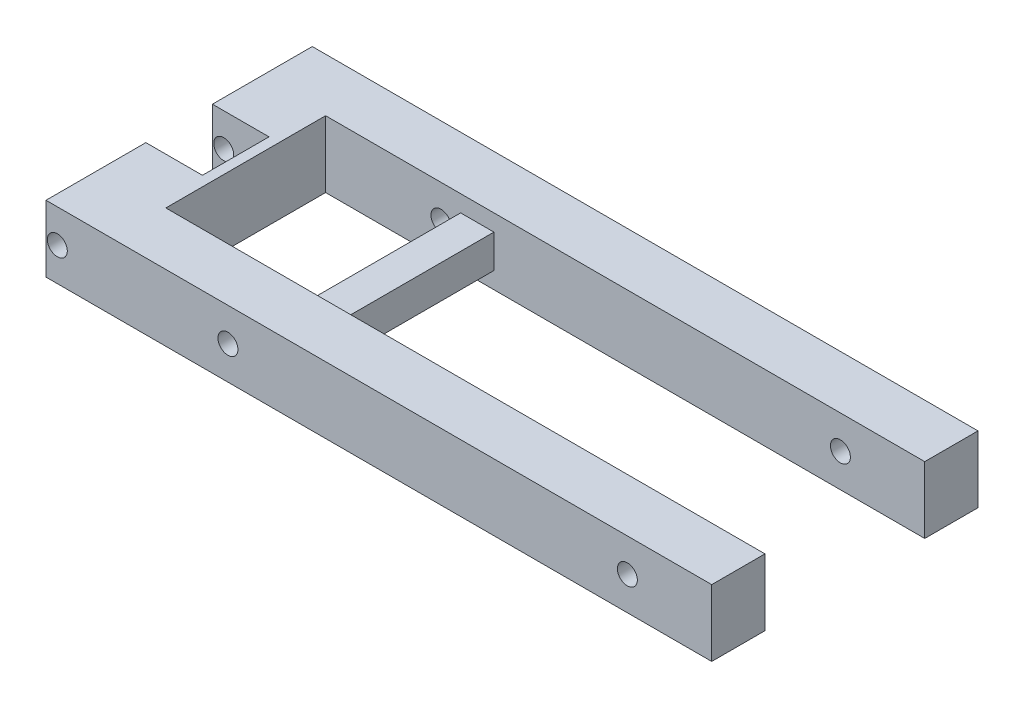
ISO-10303-21;
HEADER;
FILE_DESCRIPTION(('STEP AP214'),'2;1');
FILE_NAME('part.step','',(''),(''),'','','');
FILE_SCHEMA(('AUTOMOTIVE_DESIGN { 1 0 10303 214 1 1 1 1 }'));
ENDSEC;
DATA;
#1=APPLICATION_CONTEXT('core data for automotive mechanical design processes');
#2=APPLICATION_PROTOCOL_DEFINITION('international standard','automotive_design',2000,#1);
#3=PRODUCT_CONTEXT('',#1,'mechanical');
#4=PRODUCT('Part','Part','',(#3));
#5=PRODUCT_RELATED_PRODUCT_CATEGORY('part','',(#4));
#6=PRODUCT_DEFINITION_FORMATION('','',#4);
#7=PRODUCT_DEFINITION_CONTEXT('part definition',#1,'design');
#8=PRODUCT_DEFINITION('design','',#6,#7);
#9=PRODUCT_DEFINITION_SHAPE('','',#8);
#10=(LENGTH_UNIT() NAMED_UNIT(*) SI_UNIT(.MILLI.,.METRE.));
#11=(NAMED_UNIT(*) PLANE_ANGLE_UNIT() SI_UNIT($,.RADIAN.));
#12=(NAMED_UNIT(*) SI_UNIT($,.STERADIAN.) SOLID_ANGLE_UNIT());
#13=UNCERTAINTY_MEASURE_WITH_UNIT(LENGTH_MEASURE(1.E-05),#10,'distance_accuracy_value','');
#14=(GEOMETRIC_REPRESENTATION_CONTEXT(3) GLOBAL_UNCERTAINTY_ASSIGNED_CONTEXT((#13)) GLOBAL_UNIT_ASSIGNED_CONTEXT((#10,
#11,#12)) REPRESENTATION_CONTEXT('',''));
#15=CARTESIAN_POINT('',(0.,0.,0.));
#16=DIRECTION('',(0.,0.,1.));
#17=DIRECTION('',(1.,0.,0.));
#18=AXIS2_PLACEMENT_3D('',#15,#16,#17);
#19=CARTESIAN_POINT('',(-332.846822005894,100.,200.));
#20=DIRECTION('',(1.,0.,0.));
#21=DIRECTION('',(0.,0.,-1.));
#22=AXIS2_PLACEMENT_3D('',#19,#20,#21);
#23=PLANE('',#22);
#24=DIRECTION('',(0.,-1.,0.));
#25=VECTOR('',#24,1.);
#26=CARTESIAN_POINT('',(-332.846822005894,100.,50.));
#27=LINE('',#26,#25);
#28=CARTESIAN_POINT('',(-332.846822005894,100.,50.));
#29=VERTEX_POINT('',#28);
#30=CARTESIAN_POINT('',(-332.846822005894,0.,50.));
#31=VERTEX_POINT('',#30);
#32=EDGE_CURVE('E227',#29,#31,#27,.T.);
#33=ORIENTED_EDGE('',*,*,#32,.T.);
#34=DIRECTION('',(0.,0.,1.));
#35=VECTOR('',#34,1.);
#36=CARTESIAN_POINT('',(-332.846822005894,0.,200.));
#37=LINE('',#36,#35);
#38=CARTESIAN_POINT('',(-332.846822005894,0.,200.));
#39=VERTEX_POINT('',#38);
#40=EDGE_CURVE('E322',#31,#39,#37,.T.);
#41=ORIENTED_EDGE('',*,*,#40,.T.);
#42=DIRECTION('',(0.,-1.,0.));
#43=VECTOR('',#42,1.);
#44=CARTESIAN_POINT('',(-332.846822005894,100.,200.));
#45=LINE('',#44,#43);
#46=CARTESIAN_POINT('',(-332.846822005894,100.,200.));
#47=VERTEX_POINT('',#46);
#48=EDGE_CURVE('E339',#47,#39,#45,.T.);
#49=ORIENTED_EDGE('',*,*,#48,.F.);
#50=DIRECTION('',(0.,0.,1.));
#51=VECTOR('',#50,1.);
#52=CARTESIAN_POINT('',(-332.846822005894,100.,200.));
#53=LINE('',#52,#51);
#54=EDGE_CURVE('E295',#29,#47,#53,.T.);
#55=ORIENTED_EDGE('',*,*,#54,.F.);
#56=EDGE_LOOP('',(#33,#41,#49,#55));
#57=FACE_BOUND('',#56,.T.);
#58=ADVANCED_FACE('F39',(#57),#23,.F.);
#59=CARTESIAN_POINT('',(-315.846822005894,50.,-200.));
#60=DIRECTION('',(0.,0.,1.));
#61=DIRECTION('',(1.,0.,0.));
#62=AXIS2_PLACEMENT_3D('',#59,#60,#61);
#63=CYLINDRICAL_SURFACE('',#62,15.);
#64=CARTESIAN_POINT('',(-315.846822005894,50.,200.));
#65=DIRECTION('',(0.,0.,1.));
#66=DIRECTION('',(1.,0.,0.));
#67=AXIS2_PLACEMENT_3D('',#64,#65,#66);
#68=CIRCLE('',#67,15.);
#69=CARTESIAN_POINT('',(-300.846822005894,50.,200.));
#70=VERTEX_POINT('',#69);
#71=EDGE_CURVE('E237',#70,#70,#68,.T.);
#72=ORIENTED_EDGE('',*,*,#71,.T.);
#73=EDGE_LOOP('',(#72));
#74=FACE_BOUND('',#73,.T.);
#75=CARTESIAN_POINT('',(-315.846822005894,50.,50.));
#76=DIRECTION('',(0.,0.,-1.));
#77=DIRECTION('',(-1.,0.,0.));
#78=AXIS2_PLACEMENT_3D('',#75,#76,#77);
#79=CIRCLE('',#78,15.);
#80=CARTESIAN_POINT('',(-330.846822005894,50.,50.));
#81=VERTEX_POINT('',#80);
#82=EDGE_CURVE('E226',#81,#81,#79,.F.);
#83=ORIENTED_EDGE('',*,*,#82,.F.);
#84=EDGE_LOOP('',(#83));
#85=FACE_BOUND('',#84,.T.);
#86=ADVANCED_FACE('F388',(#74,#85),#63,.F.);
#87=CARTESIAN_POINT('',(667.153177994106,100.,120.));
#88=DIRECTION('',(0.,0.,1.));
#89=DIRECTION('',(1.,0.,0.));
#90=AXIS2_PLACEMENT_3D('',#87,#88,#89);
#91=PLANE('',#90);
#92=DIRECTION('',(-1.,0.,0.));
#93=VECTOR('',#92,1.);
#94=CARTESIAN_POINT('',(-30.,75.,120.));
#95=LINE('',#94,#93);
#96=CARTESIAN_POINT('',(20.,75.,120.));
#97=VERTEX_POINT('',#96);
#98=CARTESIAN_POINT('',(-30.,75.,120.));
#99=VERTEX_POINT('',#98);
#100=EDGE_CURVE('E168',#97,#99,#95,.T.);
#101=ORIENTED_EDGE('',*,*,#100,.T.);
#102=DIRECTION('',(0.,-1.,0.));
#103=VECTOR('',#102,1.);
#104=CARTESIAN_POINT('',(-30.,25.,120.));
#105=LINE('',#104,#103);
#106=CARTESIAN_POINT('',(-30.,25.,120.));
#107=VERTEX_POINT('',#106);
#108=EDGE_CURVE('E57',#99,#107,#105,.T.);
#109=ORIENTED_EDGE('',*,*,#108,.T.);
#110=DIRECTION('',(1.,0.,0.));
#111=VECTOR('',#110,1.);
#112=CARTESIAN_POINT('',(20.,25.,120.));
#113=LINE('',#112,#111);
#114=CARTESIAN_POINT('',(20.,25.,120.));
#115=VERTEX_POINT('',#114);
#116=EDGE_CURVE('E175',#107,#115,#113,.T.);
#117=ORIENTED_EDGE('',*,*,#116,.T.);
#118=DIRECTION('',(0.,1.,0.));
#119=VECTOR('',#118,1.);
#120=CARTESIAN_POINT('',(20.,75.,120.));
#121=LINE('',#120,#119);
#122=EDGE_CURVE('E158',#115,#97,#121,.T.);
#123=ORIENTED_EDGE('',*,*,#122,.T.);
#124=EDGE_LOOP('',(#101,#109,#117,#123));
#125=FACE_BOUND('',#124,.T.);
#126=CARTESIAN_POINT('',(-59.546822005894,50.,120.));
#127=DIRECTION('',(0.,0.,1.));
#128=DIRECTION('',(1.,0.,0.));
#129=AXIS2_PLACEMENT_3D('',#126,#127,#128);
#130=CIRCLE('',#129,15.0000000000001);
#131=CARTESIAN_POINT('',(-44.5468220058939,50.,120.));
#132=VERTEX_POINT('',#131);
#133=EDGE_CURVE('E273',#132,#132,#130,.T.);
#134=ORIENTED_EDGE('',*,*,#133,.T.);
#135=EDGE_LOOP('',(#134));
#136=FACE_BOUND('',#135,.T.);
#137=CARTESIAN_POINT('',(540.453177994106,50.,120.));
#138=DIRECTION('',(0.,0.,1.));
#139=DIRECTION('',(1.,0.,0.));
#140=AXIS2_PLACEMENT_3D('',#137,#138,#139);
#141=CIRCLE('',#140,15.);
#142=CARTESIAN_POINT('',(555.453177994106,50.,120.));
#143=VERTEX_POINT('',#142);
#144=EDGE_CURVE('E265',#143,#143,#141,.T.);
#145=ORIENTED_EDGE('',*,*,#144,.T.);
#146=EDGE_LOOP('',(#145));
#147=FACE_BOUND('',#146,.T.);
#148=DIRECTION('',(-1.,0.,0.));
#149=VECTOR('',#148,1.);
#150=CARTESIAN_POINT('',(667.153177994106,0.,120.));
#151=LINE('',#150,#149);
#152=CARTESIAN_POINT('',(667.153177994106,0.,120.));
#153=VERTEX_POINT('',#152);
#154=CARTESIAN_POINT('',(-232.846822005894,0.,120.));
#155=VERTEX_POINT('',#154);
#156=EDGE_CURVE('E277',#153,#155,#151,.T.);
#157=ORIENTED_EDGE('',*,*,#156,.T.);
#158=DIRECTION('',(0.,-1.,0.));
#159=VECTOR('',#158,1.);
#160=CARTESIAN_POINT('',(-232.846822005894,100.,120.));
#161=LINE('',#160,#159);
#162=CARTESIAN_POINT('',(-232.846822005894,100.,120.));
#163=VERTEX_POINT('',#162);
#164=EDGE_CURVE('E11',#163,#155,#161,.T.);
#165=ORIENTED_EDGE('',*,*,#164,.F.);
#166=DIRECTION('',(-1.,0.,0.));
#167=VECTOR('',#166,1.);
#168=CARTESIAN_POINT('',(667.153177994106,100.,120.));
#169=LINE('',#168,#167);
#170=CARTESIAN_POINT('',(667.153177994106,100.,120.));
#171=VERTEX_POINT('',#170);
#172=EDGE_CURVE('E278',#171,#163,#169,.T.);
#173=ORIENTED_EDGE('',*,*,#172,.F.);
#174=DIRECTION('',(0.,-1.,0.));
#175=VECTOR('',#174,1.);
#176=CARTESIAN_POINT('',(667.153177994106,100.,120.));
#177=LINE('',#176,#175);
#178=EDGE_CURVE('E306',#171,#153,#177,.T.);
#179=ORIENTED_EDGE('',*,*,#178,.T.);
#180=EDGE_LOOP('',(#157,#165,#173,#179));
#181=FACE_BOUND('',#180,.T.);
#182=ADVANCED_FACE('F41',(#125,#136,#147,#181),#91,.F.);
#183=CARTESIAN_POINT('',(-232.846822005894,100.,-120.));
#184=DIRECTION('',(-1.,0.,0.));
#185=DIRECTION('',(0.,0.,1.));
#186=AXIS2_PLACEMENT_3D('',#183,#184,#185);
#187=PLANE('',#186);
#188=DIRECTION('',(0.,0.,-1.));
#189=VECTOR('',#188,1.);
#190=CARTESIAN_POINT('',(-232.846822005894,0.,-120.));
#191=LINE('',#190,#189);
#192=CARTESIAN_POINT('',(-232.846822005894,0.,-120.));
#193=VERTEX_POINT('',#192);
#194=EDGE_CURVE('E310',#155,#193,#191,.T.);
#195=ORIENTED_EDGE('',*,*,#194,.T.);
#196=DIRECTION('',(0.,-1.,0.));
#197=VECTOR('',#196,1.);
#198=CARTESIAN_POINT('',(-232.846822005894,100.,-120.));
#199=LINE('',#198,#197);
#200=CARTESIAN_POINT('',(-232.846822005894,100.,-120.));
#201=VERTEX_POINT('',#200);
#202=EDGE_CURVE('E49',#201,#193,#199,.T.);
#203=ORIENTED_EDGE('',*,*,#202,.F.);
#204=DIRECTION('',(0.,0.,-1.));
#205=VECTOR('',#204,1.);
#206=CARTESIAN_POINT('',(-232.846822005894,100.,-120.));
#207=LINE('',#206,#205);
#208=EDGE_CURVE('E282',#163,#201,#207,.T.);
#209=ORIENTED_EDGE('',*,*,#208,.F.);
#210=ORIENTED_EDGE('',*,*,#164,.T.);
#211=EDGE_LOOP('',(#195,#203,#209,#210));
#212=FACE_BOUND('',#211,.T.);
#213=ADVANCED_FACE('F439',(#212),#187,.F.);
#214=CARTESIAN_POINT('',(667.153177994106,100.,-120.));
#215=DIRECTION('',(0.,0.,-1.));
#216=DIRECTION('',(-1.,0.,0.));
#217=AXIS2_PLACEMENT_3D('',#214,#215,#216);
#218=PLANE('',#217);
#219=DIRECTION('',(1.,0.,0.));
#220=VECTOR('',#219,1.);
#221=CARTESIAN_POINT('',(20.,25.,-120.));
#222=LINE('',#221,#220);
#223=CARTESIAN_POINT('',(-30.,25.,-120.));
#224=VERTEX_POINT('',#223);
#225=CARTESIAN_POINT('',(20.,25.,-120.));
#226=VERTEX_POINT('',#225);
#227=EDGE_CURVE('E185',#224,#226,#222,.T.);
#228=ORIENTED_EDGE('',*,*,#227,.F.);
#229=DIRECTION('',(0.,-1.,0.));
#230=VECTOR('',#229,1.);
#231=CARTESIAN_POINT('',(-30.,25.,-120.));
#232=LINE('',#231,#230);
#233=CARTESIAN_POINT('',(-30.,75.,-120.));
#234=VERTEX_POINT('',#233);
#235=EDGE_CURVE('E182',#234,#224,#232,.T.);
#236=ORIENTED_EDGE('',*,*,#235,.F.);
#237=DIRECTION('',(-1.,0.,0.));
#238=VECTOR('',#237,1.);
#239=CARTESIAN_POINT('',(-30.,75.,-120.));
#240=LINE('',#239,#238);
#241=CARTESIAN_POINT('',(20.,75.,-120.));
#242=VERTEX_POINT('',#241);
#243=EDGE_CURVE('E190',#242,#234,#240,.T.);
#244=ORIENTED_EDGE('',*,*,#243,.F.);
#245=DIRECTION('',(0.,1.,0.));
#246=VECTOR('',#245,1.);
#247=CARTESIAN_POINT('',(20.,75.,-120.));
#248=LINE('',#247,#246);
#249=EDGE_CURVE('E161',#226,#242,#248,.T.);
#250=ORIENTED_EDGE('',*,*,#249,.F.);
#251=EDGE_LOOP('',(#228,#236,#244,#250));
#252=FACE_BOUND('',#251,.T.);
#253=CARTESIAN_POINT('',(-59.546822005894,50.,-120.));
#254=DIRECTION('',(0.,0.,-1.));
#255=DIRECTION('',(-1.,0.,0.));
#256=AXIS2_PLACEMENT_3D('',#253,#254,#255);
#257=CIRCLE('',#256,15.0000000000001);
#258=CARTESIAN_POINT('',(-74.546822005894,50.,-120.));
#259=VERTEX_POINT('',#258);
#260=EDGE_CURVE('E269',#259,#259,#257,.T.);
#261=ORIENTED_EDGE('',*,*,#260,.T.);
#262=EDGE_LOOP('',(#261));
#263=FACE_BOUND('',#262,.T.);
#264=CARTESIAN_POINT('',(540.453177994106,50.,-120.));
#265=DIRECTION('',(0.,0.,-1.));
#266=DIRECTION('',(-1.,0.,0.));
#267=AXIS2_PLACEMENT_3D('',#264,#265,#266);
#268=CIRCLE('',#267,15.);
#269=CARTESIAN_POINT('',(525.453177994106,50.,-120.));
#270=VERTEX_POINT('',#269);
#271=EDGE_CURVE('E246',#270,#270,#268,.T.);
#272=ORIENTED_EDGE('',*,*,#271,.T.);
#273=EDGE_LOOP('',(#272));
#274=FACE_BOUND('',#273,.T.);
#275=DIRECTION('',(1.,0.,0.));
#276=VECTOR('',#275,1.);
#277=CARTESIAN_POINT('',(667.153177994106,0.,-120.));
#278=LINE('',#277,#276);
#279=CARTESIAN_POINT('',(667.153177994106,0.,-120.));
#280=VERTEX_POINT('',#279);
#281=EDGE_CURVE('E313',#193,#280,#278,.T.);
#282=ORIENTED_EDGE('',*,*,#281,.T.);
#283=DIRECTION('',(0.,-1.,0.));
#284=VECTOR('',#283,1.);
#285=CARTESIAN_POINT('',(667.153177994106,100.,-120.));
#286=LINE('',#285,#284);
#287=CARTESIAN_POINT('',(667.153177994106,100.,-120.));
#288=VERTEX_POINT('',#287);
#289=EDGE_CURVE('E351',#288,#280,#286,.T.);
#290=ORIENTED_EDGE('',*,*,#289,.F.);
#291=DIRECTION('',(1.,0.,0.));
#292=VECTOR('',#291,1.);
#293=CARTESIAN_POINT('',(667.153177994106,100.,-120.));
#294=LINE('',#293,#292);
#295=EDGE_CURVE('E286',#201,#288,#294,.T.);
#296=ORIENTED_EDGE('',*,*,#295,.F.);
#297=ORIENTED_EDGE('',*,*,#202,.T.);
#298=EDGE_LOOP('',(#282,#290,#296,#297));
#299=FACE_BOUND('',#298,.T.);
#300=ADVANCED_FACE('F435',(#252,#263,#274,#299),#218,.F.);
#301=CARTESIAN_POINT('',(667.153177994106,100.,-200.));
#302=DIRECTION('',(-1.,0.,0.));
#303=DIRECTION('',(0.,0.,1.));
#304=AXIS2_PLACEMENT_3D('',#301,#302,#303);
#305=PLANE('',#304);
#306=DIRECTION('',(0.,0.,-1.));
#307=VECTOR('',#306,1.);
#308=CARTESIAN_POINT('',(667.153177994106,0.,-200.));
#309=LINE('',#308,#307);
#310=CARTESIAN_POINT('',(667.153177994106,0.,-200.));
#311=VERTEX_POINT('',#310);
#312=EDGE_CURVE('E316',#280,#311,#309,.T.);
#313=ORIENTED_EDGE('',*,*,#312,.T.);
#314=DIRECTION('',(0.,-1.,0.));
#315=VECTOR('',#314,1.);
#316=CARTESIAN_POINT('',(667.153177994106,100.,-200.));
#317=LINE('',#316,#315);
#318=CARTESIAN_POINT('',(667.153177994106,100.,-200.));
#319=VERTEX_POINT('',#318);
#320=EDGE_CURVE('E347',#319,#311,#317,.T.);
#321=ORIENTED_EDGE('',*,*,#320,.F.);
#322=DIRECTION('',(0.,0.,-1.));
#323=VECTOR('',#322,1.);
#324=CARTESIAN_POINT('',(667.153177994106,100.,-200.));
#325=LINE('',#324,#323);
#326=EDGE_CURVE('E289',#288,#319,#325,.T.);
#327=ORIENTED_EDGE('',*,*,#326,.F.);
#328=ORIENTED_EDGE('',*,*,#289,.T.);
#329=EDGE_LOOP('',(#313,#321,#327,#328));
#330=FACE_BOUND('',#329,.T.);
#331=ADVANCED_FACE('F408',(#330),#305,.F.);
#332=CARTESIAN_POINT('',(-332.846822005894,100.,-200.));
#333=DIRECTION('',(0.,0.,1.));
#334=DIRECTION('',(1.,0.,0.));
#335=AXIS2_PLACEMENT_3D('',#332,#333,#334);
#336=PLANE('',#335);
#337=CARTESIAN_POINT('',(-315.846822005894,50.,-200.));
#338=DIRECTION('',(0.,0.,1.));
#339=DIRECTION('',(1.,0.,0.));
#340=AXIS2_PLACEMENT_3D('',#337,#338,#339);
#341=CIRCLE('',#340,15.);
#342=CARTESIAN_POINT('',(-300.846822005894,50.,-200.));
#343=VERTEX_POINT('',#342);
#344=EDGE_CURVE('E241',#343,#343,#341,.T.);
#345=ORIENTED_EDGE('',*,*,#344,.T.);
#346=EDGE_LOOP('',(#345));
#347=FACE_BOUND('',#346,.T.);
#348=CARTESIAN_POINT('',(-59.546822005894,50.,-200.));
#349=DIRECTION('',(0.,0.,1.));
#350=DIRECTION('',(1.,0.,0.));
#351=AXIS2_PLACEMENT_3D('',#348,#349,#350);
#352=CIRCLE('',#351,15.0000000000001);
#353=CARTESIAN_POINT('',(-44.5468220058939,50.,-200.));
#354=VERTEX_POINT('',#353);
#355=EDGE_CURVE('E242',#354,#354,#352,.T.);
#356=ORIENTED_EDGE('',*,*,#355,.T.);
#357=EDGE_LOOP('',(#356));
#358=FACE_BOUND('',#357,.T.);
#359=CARTESIAN_POINT('',(540.453177994106,50.,-200.));
#360=DIRECTION('',(0.,0.,1.));
#361=DIRECTION('',(1.,0.,0.));
#362=AXIS2_PLACEMENT_3D('',#359,#360,#361);
#363=CIRCLE('',#362,15.);
#364=CARTESIAN_POINT('',(555.453177994106,50.,-200.));
#365=VERTEX_POINT('',#364);
#366=EDGE_CURVE('E251',#365,#365,#363,.T.);
#367=ORIENTED_EDGE('',*,*,#366,.T.);
#368=EDGE_LOOP('',(#367));
#369=FACE_BOUND('',#368,.T.);
#370=DIRECTION('',(-1.,0.,0.));
#371=VECTOR('',#370,1.);
#372=CARTESIAN_POINT('',(-332.846822005894,0.,-200.));
#373=LINE('',#372,#371);
#374=CARTESIAN_POINT('',(-332.846822005894,0.,-200.));
#375=VERTEX_POINT('',#374);
#376=EDGE_CURVE('E319',#311,#375,#373,.T.);
#377=ORIENTED_EDGE('',*,*,#376,.T.);
#378=DIRECTION('',(0.,-1.,0.));
#379=VECTOR('',#378,1.);
#380=CARTESIAN_POINT('',(-332.846822005894,100.,-200.));
#381=LINE('',#380,#379);
#382=CARTESIAN_POINT('',(-332.846822005894,100.,-200.));
#383=VERTEX_POINT('',#382);
#384=EDGE_CURVE('E343',#383,#375,#381,.T.);
#385=ORIENTED_EDGE('',*,*,#384,.F.);
#386=DIRECTION('',(-1.,0.,0.));
#387=VECTOR('',#386,1.);
#388=CARTESIAN_POINT('',(-332.846822005894,100.,-200.));
#389=LINE('',#388,#387);
#390=EDGE_CURVE('E292',#319,#383,#389,.T.);
#391=ORIENTED_EDGE('',*,*,#390,.F.);
#392=ORIENTED_EDGE('',*,*,#320,.T.);
#393=EDGE_LOOP('',(#377,#385,#391,#392));
#394=FACE_BOUND('',#393,.T.);
#395=ADVANCED_FACE('F400',(#347,#358,#369,#394),#336,.F.);
#396=CARTESIAN_POINT('',(-332.846822005894,0.,-50.));
#397=VERTEX_POINT('',#396);
#398=EDGE_CURVE('E323',#375,#397,#37,.T.);
#399=ORIENTED_EDGE('',*,*,#398,.T.);
#400=DIRECTION('',(0.,-1.,0.));
#401=VECTOR('',#400,1.);
#402=CARTESIAN_POINT('',(-332.846822005894,100.,-50.));
#403=LINE('',#402,#401);
#404=CARTESIAN_POINT('',(-332.846822005894,100.,-50.));
#405=VERTEX_POINT('',#404);
#406=EDGE_CURVE('E223',#405,#397,#403,.T.);
#407=ORIENTED_EDGE('',*,*,#406,.F.);
#408=EDGE_CURVE('E296',#383,#405,#53,.T.);
#409=ORIENTED_EDGE('',*,*,#408,.F.);
#410=ORIENTED_EDGE('',*,*,#384,.T.);
#411=EDGE_LOOP('',(#399,#407,#409,#410));
#412=FACE_BOUND('',#411,.T.);
#413=ADVANCED_FACE('F391',(#412),#23,.F.);
#414=CARTESIAN_POINT('',(-332.846822005894,100.,200.));
#415=DIRECTION('',(0.,0.,-1.));
#416=DIRECTION('',(-1.,0.,0.));
#417=AXIS2_PLACEMENT_3D('',#414,#415,#416);
#418=PLANE('',#417);
#419=ORIENTED_EDGE('',*,*,#71,.F.);
#420=EDGE_LOOP('',(#419));
#421=FACE_BOUND('',#420,.T.);
#422=CARTESIAN_POINT('',(-59.546822005894,50.,200.));
#423=DIRECTION('',(0.,0.,1.));
#424=DIRECTION('',(1.,0.,0.));
#425=AXIS2_PLACEMENT_3D('',#422,#423,#424);
#426=CIRCLE('',#425,15.0000000000001);
#427=CARTESIAN_POINT('',(-44.5468220058939,50.,200.));
#428=VERTEX_POINT('',#427);
#429=EDGE_CURVE('E247',#428,#428,#426,.T.);
#430=ORIENTED_EDGE('',*,*,#429,.F.);
#431=EDGE_LOOP('',(#430));
#432=FACE_BOUND('',#431,.T.);
#433=CARTESIAN_POINT('',(540.453177994106,50.,200.));
#434=DIRECTION('',(0.,0.,1.));
#435=DIRECTION('',(1.,0.,0.));
#436=AXIS2_PLACEMENT_3D('',#433,#434,#435);
#437=CIRCLE('',#436,15.);
#438=CARTESIAN_POINT('',(555.453177994106,50.,200.));
#439=VERTEX_POINT('',#438);
#440=EDGE_CURVE('E255',#439,#439,#437,.T.);
#441=ORIENTED_EDGE('',*,*,#440,.F.);
#442=EDGE_LOOP('',(#441));
#443=FACE_BOUND('',#442,.T.);
#444=DIRECTION('',(1.,0.,0.));
#445=VECTOR('',#444,1.);
#446=CARTESIAN_POINT('',(-332.846822005894,0.,200.));
#447=LINE('',#446,#445);
#448=CARTESIAN_POINT('',(667.153177994106,0.,200.));
#449=VERTEX_POINT('',#448);
#450=EDGE_CURVE('E327',#39,#449,#447,.T.);
#451=ORIENTED_EDGE('',*,*,#450,.T.);
#452=DIRECTION('',(0.,-1.,0.));
#453=VECTOR('',#452,1.);
#454=CARTESIAN_POINT('',(667.153177994106,100.,200.));
#455=LINE('',#454,#453);
#456=CARTESIAN_POINT('',(667.153177994106,100.,200.));
#457=VERTEX_POINT('',#456);
#458=EDGE_CURVE('E335',#457,#449,#455,.T.);
#459=ORIENTED_EDGE('',*,*,#458,.F.);
#460=DIRECTION('',(1.,0.,0.));
#461=VECTOR('',#460,1.);
#462=CARTESIAN_POINT('',(-332.846822005894,100.,200.));
#463=LINE('',#462,#461);
#464=EDGE_CURVE('E300',#47,#457,#463,.T.);
#465=ORIENTED_EDGE('',*,*,#464,.F.);
#466=ORIENTED_EDGE('',*,*,#48,.T.);
#467=EDGE_LOOP('',(#451,#459,#465,#466));
#468=FACE_BOUND('',#467,.T.);
#469=ADVANCED_FACE('F399',(#421,#432,#443,#468),#418,.F.);
#470=CARTESIAN_POINT('',(667.153177994106,100.,200.));
#471=DIRECTION('',(-1.,0.,0.));
#472=DIRECTION('',(0.,0.,1.));
#473=AXIS2_PLACEMENT_3D('',#470,#471,#472);
#474=PLANE('',#473);
#475=DIRECTION('',(0.,0.,-1.));
#476=VECTOR('',#475,1.);
#477=CARTESIAN_POINT('',(667.153177994106,0.,200.));
#478=LINE('',#477,#476);
#479=EDGE_CURVE('E283',#449,#153,#478,.T.);
#480=ORIENTED_EDGE('',*,*,#479,.T.);
#481=ORIENTED_EDGE('',*,*,#178,.F.);
#482=DIRECTION('',(0.,0.,-1.));
#483=VECTOR('',#482,1.);
#484=CARTESIAN_POINT('',(667.153177994106,100.,200.));
#485=LINE('',#484,#483);
#486=EDGE_CURVE('E303',#457,#171,#485,.T.);
#487=ORIENTED_EDGE('',*,*,#486,.F.);
#488=ORIENTED_EDGE('',*,*,#458,.T.);
#489=EDGE_LOOP('',(#480,#481,#487,#488));
#490=FACE_BOUND('',#489,.T.);
#491=ADVANCED_FACE('F406',(#490),#474,.F.);
#492=CARTESIAN_POINT('',(0.,100.,0.));
#493=DIRECTION('',(0.,1.,0.));
#494=DIRECTION('',(0.,0.,1.));
#495=AXIS2_PLACEMENT_3D('',#492,#493,#494);
#496=PLANE('',#495);
#497=DIRECTION('',(1.,0.,0.));
#498=VECTOR('',#497,1.);
#499=CARTESIAN_POINT('',(-332.846822005894,100.,-50.));
#500=LINE('',#499,#498);
#501=CARTESIAN_POINT('',(-247.846822005894,100.,-50.));
#502=VERTEX_POINT('',#501);
#503=EDGE_CURVE('E201',#405,#502,#500,.T.);
#504=ORIENTED_EDGE('',*,*,#503,.T.);
#505=DIRECTION('',(0.,0.,1.));
#506=VECTOR('',#505,1.);
#507=CARTESIAN_POINT('',(-247.846822005894,100.,-50.));
#508=LINE('',#507,#506);
#509=CARTESIAN_POINT('',(-247.846822005894,100.,50.));
#510=VERTEX_POINT('',#509);
#511=EDGE_CURVE('E205',#502,#510,#508,.T.);
#512=ORIENTED_EDGE('',*,*,#511,.T.);
#513=DIRECTION('',(1.,0.,0.));
#514=VECTOR('',#513,1.);
#515=CARTESIAN_POINT('',(-332.846822005894,100.,50.));
#516=LINE('',#515,#514);
#517=EDGE_CURVE('E210',#29,#510,#516,.T.);
#518=ORIENTED_EDGE('',*,*,#517,.F.);
#519=ORIENTED_EDGE('',*,*,#54,.T.);
#520=ORIENTED_EDGE('',*,*,#464,.T.);
#521=ORIENTED_EDGE('',*,*,#486,.T.);
#522=ORIENTED_EDGE('',*,*,#172,.T.);
#523=ORIENTED_EDGE('',*,*,#208,.T.);
#524=ORIENTED_EDGE('',*,*,#295,.T.);
#525=ORIENTED_EDGE('',*,*,#326,.T.);
#526=ORIENTED_EDGE('',*,*,#390,.T.);
#527=ORIENTED_EDGE('',*,*,#408,.T.);
#528=EDGE_LOOP('',(#504,#512,#518,#519,#520,#521,#522,#523,#524,#525,#526,#527));
#529=FACE_BOUND('',#528,.T.);
#530=ADVANCED_FACE('F425',(#529),#496,.T.);
#531=CARTESIAN_POINT('',(0.,0.,0.));
#532=DIRECTION('',(0.,1.,0.));
#533=DIRECTION('',(0.,0.,1.));
#534=AXIS2_PLACEMENT_3D('',#531,#532,#533);
#535=PLANE('',#534);
#536=DIRECTION('',(0.,0.,1.));
#537=VECTOR('',#536,1.);
#538=CARTESIAN_POINT('',(-247.846822005894,0.,-50.));
#539=LINE('',#538,#537);
#540=CARTESIAN_POINT('',(-247.846822005894,0.,-50.));
#541=VERTEX_POINT('',#540);
#542=CARTESIAN_POINT('',(-247.846822005894,0.,50.));
#543=VERTEX_POINT('',#542);
#544=EDGE_CURVE('E216',#541,#543,#539,.T.);
#545=ORIENTED_EDGE('',*,*,#544,.F.);
#546=DIRECTION('',(1.,0.,0.));
#547=VECTOR('',#546,1.);
#548=CARTESIAN_POINT('',(-332.846822005894,0.,-50.));
#549=LINE('',#548,#547);
#550=EDGE_CURVE('E200',#397,#541,#549,.T.);
#551=ORIENTED_EDGE('',*,*,#550,.F.);
#552=ORIENTED_EDGE('',*,*,#398,.F.);
#553=ORIENTED_EDGE('',*,*,#376,.F.);
#554=ORIENTED_EDGE('',*,*,#312,.F.);
#555=ORIENTED_EDGE('',*,*,#281,.F.);
#556=ORIENTED_EDGE('',*,*,#194,.F.);
#557=ORIENTED_EDGE('',*,*,#156,.F.);
#558=ORIENTED_EDGE('',*,*,#479,.F.);
#559=ORIENTED_EDGE('',*,*,#450,.F.);
#560=ORIENTED_EDGE('',*,*,#40,.F.);
#561=DIRECTION('',(1.,0.,0.));
#562=VECTOR('',#561,1.);
#563=CARTESIAN_POINT('',(-332.846822005894,0.,50.));
#564=LINE('',#563,#562);
#565=EDGE_CURVE('E206',#31,#543,#564,.T.);
#566=ORIENTED_EDGE('',*,*,#565,.T.);
#567=EDGE_LOOP('',(#545,#551,#552,#553,#554,#555,#556,#557,#558,#559,#560,#566));
#568=FACE_BOUND('',#567,.T.);
#569=ADVANCED_FACE('F418',(#568),#535,.F.);
#570=CARTESIAN_POINT('',(540.453177994106,50.,-200.));
#571=DIRECTION('',(0.,0.,1.));
#572=DIRECTION('',(1.,0.,0.));
#573=AXIS2_PLACEMENT_3D('',#570,#571,#572);
#574=CYLINDRICAL_SURFACE('',#573,15.);
#575=ORIENTED_EDGE('',*,*,#440,.T.);
#576=EDGE_LOOP('',(#575));
#577=FACE_BOUND('',#576,.T.);
#578=ORIENTED_EDGE('',*,*,#144,.F.);
#579=EDGE_LOOP('',(#578));
#580=FACE_BOUND('',#579,.T.);
#581=ADVANCED_FACE('F464',(#577,#580),#574,.F.);
#582=CARTESIAN_POINT('',(-59.546822005894,50.,-200.));
#583=DIRECTION('',(0.,0.,1.));
#584=DIRECTION('',(1.,0.,0.));
#585=AXIS2_PLACEMENT_3D('',#582,#583,#584);
#586=CYLINDRICAL_SURFACE('',#585,15.0000000000001);
#587=ORIENTED_EDGE('',*,*,#429,.T.);
#588=EDGE_LOOP('',(#587));
#589=FACE_BOUND('',#588,.T.);
#590=ORIENTED_EDGE('',*,*,#133,.F.);
#591=EDGE_LOOP('',(#590));
#592=FACE_BOUND('',#591,.T.);
#593=ADVANCED_FACE('F384',(#589,#592),#586,.F.);
#594=CARTESIAN_POINT('',(-315.846822005894,50.,-50.));
#595=DIRECTION('',(0.,0.,-1.));
#596=DIRECTION('',(-1.,0.,0.));
#597=AXIS2_PLACEMENT_3D('',#594,#595,#596);
#598=CIRCLE('',#597,15.);
#599=CARTESIAN_POINT('',(-330.846822005894,50.,-50.));
#600=VERTEX_POINT('',#599);
#601=EDGE_CURVE('E43',#600,#600,#598,.F.);
#602=ORIENTED_EDGE('',*,*,#601,.T.);
#603=EDGE_LOOP('',(#602));
#604=FACE_BOUND('',#603,.T.);
#605=ORIENTED_EDGE('',*,*,#344,.F.);
#606=EDGE_LOOP('',(#605));
#607=FACE_BOUND('',#606,.T.);
#608=ADVANCED_FACE('F365',(#604,#607),#63,.F.);
#609=ORIENTED_EDGE('',*,*,#366,.F.);
#610=EDGE_LOOP('',(#609));
#611=FACE_BOUND('',#610,.T.);
#612=ORIENTED_EDGE('',*,*,#271,.F.);
#613=EDGE_LOOP('',(#612));
#614=FACE_BOUND('',#613,.T.);
#615=ADVANCED_FACE('F381',(#611,#614),#574,.F.);
#616=ORIENTED_EDGE('',*,*,#355,.F.);
#617=EDGE_LOOP('',(#616));
#618=FACE_BOUND('',#617,.T.);
#619=ORIENTED_EDGE('',*,*,#260,.F.);
#620=EDGE_LOOP('',(#619));
#621=FACE_BOUND('',#620,.T.);
#622=ADVANCED_FACE('F371',(#618,#621),#586,.F.);
#623=CARTESIAN_POINT('',(-332.846822005894,100.,-50.));
#624=DIRECTION('',(0.,0.,-1.));
#625=DIRECTION('',(-1.,0.,0.));
#626=AXIS2_PLACEMENT_3D('',#623,#624,#625);
#627=PLANE('',#626);
#628=ORIENTED_EDGE('',*,*,#550,.T.);
#629=DIRECTION('',(0.,-1.,0.));
#630=VECTOR('',#629,1.);
#631=CARTESIAN_POINT('',(-247.846822005894,100.,-50.));
#632=LINE('',#631,#630);
#633=EDGE_CURVE('E213',#502,#541,#632,.T.);
#634=ORIENTED_EDGE('',*,*,#633,.F.);
#635=ORIENTED_EDGE('',*,*,#503,.F.);
#636=ORIENTED_EDGE('',*,*,#406,.T.);
#637=EDGE_LOOP('',(#628,#634,#635,#636));
#638=FACE_BOUND('',#637,.T.);
#639=ORIENTED_EDGE('',*,*,#601,.F.);
#640=EDGE_LOOP('',(#639));
#641=FACE_BOUND('',#640,.T.);
#642=ADVANCED_FACE('F368',(#638,#641),#627,.F.);
#643=CARTESIAN_POINT('',(-332.846822005894,100.,50.));
#644=DIRECTION('',(0.,0.,-1.));
#645=DIRECTION('',(-1.,0.,0.));
#646=AXIS2_PLACEMENT_3D('',#643,#644,#645);
#647=PLANE('',#646);
#648=ORIENTED_EDGE('',*,*,#565,.F.);
#649=ORIENTED_EDGE('',*,*,#32,.F.);
#650=ORIENTED_EDGE('',*,*,#517,.T.);
#651=DIRECTION('',(0.,-1.,0.));
#652=VECTOR('',#651,1.);
#653=CARTESIAN_POINT('',(-247.846822005894,100.,50.));
#654=LINE('',#653,#652);
#655=EDGE_CURVE('E231',#510,#543,#654,.T.);
#656=ORIENTED_EDGE('',*,*,#655,.T.);
#657=EDGE_LOOP('',(#648,#649,#650,#656));
#658=FACE_BOUND('',#657,.T.);
#659=ORIENTED_EDGE('',*,*,#82,.T.);
#660=EDGE_LOOP('',(#659));
#661=FACE_BOUND('',#660,.T.);
#662=ADVANCED_FACE('F370',(#658,#661),#647,.T.);
#663=CARTESIAN_POINT('',(-247.846822005894,100.,-50.));
#664=DIRECTION('',(1.,0.,0.));
#665=DIRECTION('',(0.,0.,-1.));
#666=AXIS2_PLACEMENT_3D('',#663,#664,#665);
#667=PLANE('',#666);
#668=ORIENTED_EDGE('',*,*,#544,.T.);
#669=ORIENTED_EDGE('',*,*,#655,.F.);
#670=ORIENTED_EDGE('',*,*,#511,.F.);
#671=ORIENTED_EDGE('',*,*,#633,.T.);
#672=EDGE_LOOP('',(#668,#669,#670,#671));
#673=FACE_BOUND('',#672,.T.);
#674=ADVANCED_FACE('F378',(#673),#667,.F.);
#675=CARTESIAN_POINT('',(-30.,25.,-200.002));
#676=DIRECTION('',(-1.,0.,0.));
#677=DIRECTION('',(0.,0.,1.));
#678=AXIS2_PLACEMENT_3D('',#675,#676,#677);
#679=PLANE('',#678);
#680=DIRECTION('',(0.,0.,1.));
#681=VECTOR('',#680,1.);
#682=CARTESIAN_POINT('',(-30.,75.,-200.002));
#683=LINE('',#682,#681);
#684=EDGE_CURVE('E164',#234,#99,#683,.T.);
#685=ORIENTED_EDGE('',*,*,#684,.F.);
#686=ORIENTED_EDGE('',*,*,#235,.T.);
#687=DIRECTION('',(0.,0.,1.));
#688=VECTOR('',#687,1.);
#689=CARTESIAN_POINT('',(-30.,25.,-200.002));
#690=LINE('',#689,#688);
#691=EDGE_CURVE('E193',#224,#107,#690,.T.);
#692=ORIENTED_EDGE('',*,*,#691,.T.);
#693=ORIENTED_EDGE('',*,*,#108,.F.);
#694=EDGE_LOOP('',(#685,#686,#692,#693));
#695=FACE_BOUND('',#694,.T.);
#696=ADVANCED_FACE('F497',(#695),#679,.T.);
#697=CARTESIAN_POINT('',(20.,25.,-200.002));
#698=DIRECTION('',(0.,-1.,0.));
#699=DIRECTION('',(1.,0.,0.));
#700=AXIS2_PLACEMENT_3D('',#697,#698,#699);
#701=PLANE('',#700);
#702=ORIENTED_EDGE('',*,*,#691,.F.);
#703=ORIENTED_EDGE('',*,*,#227,.T.);
#704=DIRECTION('',(0.,0.,1.));
#705=VECTOR('',#704,1.);
#706=CARTESIAN_POINT('',(20.,25.,-200.002));
#707=LINE('',#706,#705);
#708=EDGE_CURVE('E165',#226,#115,#707,.T.);
#709=ORIENTED_EDGE('',*,*,#708,.T.);
#710=ORIENTED_EDGE('',*,*,#116,.F.);
#711=EDGE_LOOP('',(#702,#703,#709,#710));
#712=FACE_BOUND('',#711,.T.);
#713=ADVANCED_FACE('F496',(#712),#701,.T.);
#714=CARTESIAN_POINT('',(20.,75.,-200.002));
#715=DIRECTION('',(1.,0.,0.));
#716=DIRECTION('',(0.,1.,0.));
#717=AXIS2_PLACEMENT_3D('',#714,#715,#716);
#718=PLANE('',#717);
#719=ORIENTED_EDGE('',*,*,#708,.F.);
#720=ORIENTED_EDGE('',*,*,#249,.T.);
#721=DIRECTION('',(0.,0.,1.));
#722=VECTOR('',#721,1.);
#723=CARTESIAN_POINT('',(20.,75.,-200.002));
#724=LINE('',#723,#722);
#725=EDGE_CURVE('E65',#242,#97,#724,.T.);
#726=ORIENTED_EDGE('',*,*,#725,.T.);
#727=ORIENTED_EDGE('',*,*,#122,.F.);
#728=EDGE_LOOP('',(#719,#720,#726,#727));
#729=FACE_BOUND('',#728,.T.);
#730=ADVANCED_FACE('F156',(#729),#718,.T.);
#731=CARTESIAN_POINT('',(-30.,75.,-200.002));
#732=DIRECTION('',(0.,1.,0.));
#733=DIRECTION('',(0.,0.,1.));
#734=AXIS2_PLACEMENT_3D('',#731,#732,#733);
#735=PLANE('',#734);
#736=ORIENTED_EDGE('',*,*,#725,.F.);
#737=ORIENTED_EDGE('',*,*,#243,.T.);
#738=ORIENTED_EDGE('',*,*,#684,.T.);
#739=ORIENTED_EDGE('',*,*,#100,.F.);
#740=EDGE_LOOP('',(#736,#737,#738,#739));
#741=FACE_BOUND('',#740,.T.);
#742=ADVANCED_FACE('F169',(#741),#735,.T.);
#743=CLOSED_SHELL('',(#58,#86,#182,#213,#300,#331,#395,#413,#469,#491,#530,#569,#581,#593,#608,
#615,#622,#642,#662,#674,#696,#713,#730,#742));
#744=MANIFOLD_SOLID_BREP('B2',#743);
#745=ADVANCED_BREP_SHAPE_REPRESENTATION('',(#18,#744),#14);
#746=SHAPE_DEFINITION_REPRESENTATION(#9,#745);
ENDSEC;
END-ISO-10303-21;
